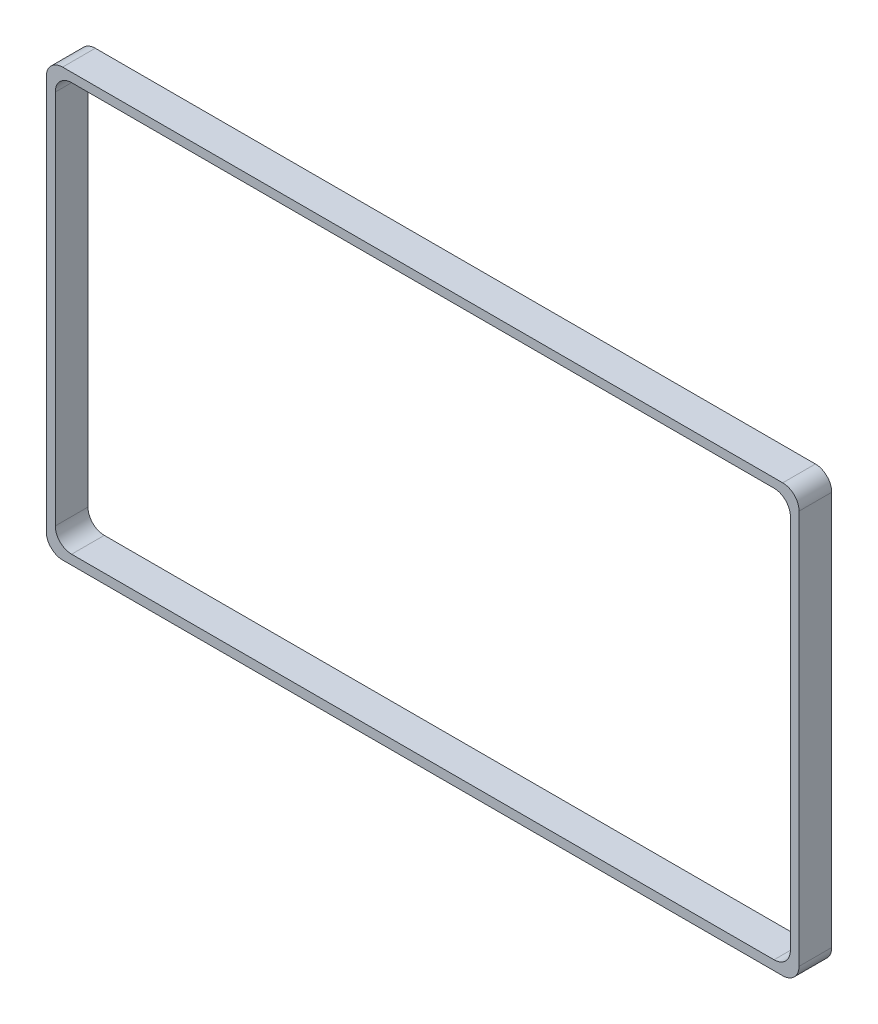
ISO-10303-21;
HEADER;
FILE_DESCRIPTION(('STEP AP214'),'2;1');
FILE_NAME('part.step','',(''),(''),'','','');
FILE_SCHEMA(('AUTOMOTIVE_DESIGN { 1 0 10303 214 1 1 1 1 }'));
ENDSEC;
DATA;
#1=APPLICATION_CONTEXT('core data for automotive mechanical design processes');
#2=APPLICATION_PROTOCOL_DEFINITION('international standard','automotive_design',2000,#1);
#3=PRODUCT_CONTEXT('',#1,'mechanical');
#4=PRODUCT('Part','Part','',(#3));
#5=PRODUCT_RELATED_PRODUCT_CATEGORY('part','',(#4));
#6=PRODUCT_DEFINITION_FORMATION('','',#4);
#7=PRODUCT_DEFINITION_CONTEXT('part definition',#1,'design');
#8=PRODUCT_DEFINITION('design','',#6,#7);
#9=PRODUCT_DEFINITION_SHAPE('','',#8);
#10=(LENGTH_UNIT() NAMED_UNIT(*) SI_UNIT(.MILLI.,.METRE.));
#11=(NAMED_UNIT(*) PLANE_ANGLE_UNIT() SI_UNIT($,.RADIAN.));
#12=(NAMED_UNIT(*) SI_UNIT($,.STERADIAN.) SOLID_ANGLE_UNIT());
#13=UNCERTAINTY_MEASURE_WITH_UNIT(LENGTH_MEASURE(1.E-05),#10,'distance_accuracy_value','');
#14=(GEOMETRIC_REPRESENTATION_CONTEXT(3) GLOBAL_UNCERTAINTY_ASSIGNED_CONTEXT((#13)) GLOBAL_UNIT_ASSIGNED_CONTEXT((#10,
#11,#12)) REPRESENTATION_CONTEXT('',''));
#15=CARTESIAN_POINT('',(0.,0.,0.));
#16=DIRECTION('',(0.,0.,1.));
#17=DIRECTION('',(1.,0.,0.));
#18=AXIS2_PLACEMENT_3D('',#15,#16,#17);
#19=CARTESIAN_POINT('',(-3.36666666666667,0.,0.2));
#20=DIRECTION('',(1.,0.,0.));
#21=DIRECTION('',(0.,1.,0.));
#22=AXIS2_PLACEMENT_3D('',#19,#20,#21);
#23=PLANE('',#22);
#24=DIRECTION('',(0.,-1.,0.));
#25=VECTOR('',#24,1.);
#26=CARTESIAN_POINT('',(-3.36666666666667,0.,0.2));
#27=LINE('',#26,#25);
#28=CARTESIAN_POINT('',(-3.36666666666667,2.45833333333333,0.2));
#29=VERTEX_POINT('',#28);
#30=CARTESIAN_POINT('',(-3.36666666666667,0.158333333333334,0.2));
#31=VERTEX_POINT('',#30);
#32=EDGE_CURVE('E250',#29,#31,#27,.T.);
#33=ORIENTED_EDGE('',*,*,#32,.T.);
#34=DIRECTION('',(0.,0.,-1.));
#35=VECTOR('',#34,1.);
#36=CARTESIAN_POINT('',(-3.36666666666667,0.158333333333334,0.));
#37=LINE('',#36,#35);
#38=CARTESIAN_POINT('',(-3.36666666666667,0.158333333333334,0.));
#39=VERTEX_POINT('',#38);
#40=EDGE_CURVE('E225',#31,#39,#37,.T.);
#41=ORIENTED_EDGE('',*,*,#40,.T.);
#42=DIRECTION('',(0.,-1.,0.));
#43=VECTOR('',#42,1.);
#44=CARTESIAN_POINT('',(-3.36666666666667,0.,0.));
#45=LINE('',#44,#43);
#46=CARTESIAN_POINT('',(-3.36666666666667,2.45833333333333,0.));
#47=VERTEX_POINT('',#46);
#48=EDGE_CURVE('E155',#47,#39,#45,.T.);
#49=ORIENTED_EDGE('',*,*,#48,.F.);
#50=DIRECTION('',(0.,0.,-1.));
#51=VECTOR('',#50,1.);
#52=CARTESIAN_POINT('',(-3.36666666666667,2.45833333333333,0.2));
#53=LINE('',#52,#51);
#54=EDGE_CURVE('E223',#47,#29,#53,.F.);
#55=ORIENTED_EDGE('',*,*,#54,.T.);
#56=EDGE_LOOP('',(#33,#41,#49,#55));
#57=FACE_BOUND('',#56,.T.);
#58=ADVANCED_FACE('F36',(#57),#23,.T.);
#59=CARTESIAN_POINT('',(0.,2.55833333333333,0.2));
#60=DIRECTION('',(0.,1.,0.));
#61=DIRECTION('',(0.,0.,1.));
#62=AXIS2_PLACEMENT_3D('',#59,#60,#61);
#63=PLANE('',#62);
#64=DIRECTION('',(1.,0.,0.));
#65=VECTOR('',#64,1.);
#66=CARTESIAN_POINT('',(0.,2.55833333333333,0.));
#67=LINE('',#66,#65);
#68=CARTESIAN_POINT('',(-3.26666666666667,2.55833333333333,0.));
#69=VERTEX_POINT('',#68);
#70=CARTESIAN_POINT('',(1.03333333333333,2.55833333333333,0.));
#71=VERTEX_POINT('',#70);
#72=EDGE_CURVE('E239',#69,#71,#67,.T.);
#73=ORIENTED_EDGE('',*,*,#72,.T.);
#74=DIRECTION('',(0.,0.,-1.));
#75=VECTOR('',#74,1.);
#76=CARTESIAN_POINT('',(1.03333333333333,2.55833333333333,0.2));
#77=LINE('',#76,#75);
#78=CARTESIAN_POINT('',(1.03333333333333,2.55833333333333,0.2));
#79=VERTEX_POINT('',#78);
#80=EDGE_CURVE('E51',#71,#79,#77,.F.);
#81=ORIENTED_EDGE('',*,*,#80,.T.);
#82=DIRECTION('',(1.,0.,0.));
#83=VECTOR('',#82,1.);
#84=CARTESIAN_POINT('',(0.,2.55833333333333,0.2));
#85=LINE('',#84,#83);
#86=CARTESIAN_POINT('',(-3.26666666666667,2.55833333333333,0.2));
#87=VERTEX_POINT('',#86);
#88=EDGE_CURVE('E248',#87,#79,#85,.T.);
#89=ORIENTED_EDGE('',*,*,#88,.F.);
#90=DIRECTION('',(0.,0.,-1.));
#91=VECTOR('',#90,1.);
#92=CARTESIAN_POINT('',(-3.26666666666667,2.55833333333333,0.2));
#93=LINE('',#92,#91);
#94=EDGE_CURVE('E219',#87,#69,#93,.T.);
#95=ORIENTED_EDGE('',*,*,#94,.T.);
#96=EDGE_LOOP('',(#73,#81,#89,#95));
#97=FACE_BOUND('',#96,.T.);
#98=ADVANCED_FACE('F247',(#97),#63,.F.);
#99=CARTESIAN_POINT('',(1.13333333333333,0.,0.2));
#100=DIRECTION('',(1.,0.,0.));
#101=DIRECTION('',(0.,1.,0.));
#102=AXIS2_PLACEMENT_3D('',#99,#100,#101);
#103=PLANE('',#102);
#104=DIRECTION('',(0.,-1.,0.));
#105=VECTOR('',#104,1.);
#106=CARTESIAN_POINT('',(1.13333333333333,0.,0.));
#107=LINE('',#106,#105);
#108=CARTESIAN_POINT('',(1.13333333333333,2.45833333333333,0.));
#109=VERTEX_POINT('',#108);
#110=CARTESIAN_POINT('',(1.13333333333333,0.158333333333334,0.));
#111=VERTEX_POINT('',#110);
#112=EDGE_CURVE('E172',#109,#111,#107,.T.);
#113=ORIENTED_EDGE('',*,*,#112,.T.);
#114=DIRECTION('',(0.,0.,-1.));
#115=VECTOR('',#114,1.);
#116=CARTESIAN_POINT('',(1.13333333333333,0.158333333333334,0.2));
#117=LINE('',#116,#115);
#118=CARTESIAN_POINT('',(1.13333333333333,0.158333333333334,0.2));
#119=VERTEX_POINT('',#118);
#120=EDGE_CURVE('E186',#111,#119,#117,.F.);
#121=ORIENTED_EDGE('',*,*,#120,.T.);
#122=DIRECTION('',(0.,-1.,0.));
#123=VECTOR('',#122,1.);
#124=CARTESIAN_POINT('',(1.13333333333333,0.,0.2));
#125=LINE('',#124,#123);
#126=CARTESIAN_POINT('',(1.13333333333333,2.45833333333333,0.2));
#127=VERTEX_POINT('',#126);
#128=EDGE_CURVE('E180',#127,#119,#125,.T.);
#129=ORIENTED_EDGE('',*,*,#128,.F.);
#130=DIRECTION('',(0.,0.,-1.));
#131=VECTOR('',#130,1.);
#132=CARTESIAN_POINT('',(1.13333333333333,2.45833333333333,0.));
#133=LINE('',#132,#131);
#134=EDGE_CURVE('E178',#127,#109,#133,.T.);
#135=ORIENTED_EDGE('',*,*,#134,.T.);
#136=EDGE_LOOP('',(#113,#121,#129,#135));
#137=FACE_BOUND('',#136,.T.);
#138=ADVANCED_FACE('F273',(#137),#103,.F.);
#139=CARTESIAN_POINT('',(0.,2.61331643610564,0.2));
#140=DIRECTION('',(0.,1.,0.));
#141=DIRECTION('',(0.,0.,1.));
#142=AXIS2_PLACEMENT_3D('',#139,#140,#141);
#143=PLANE('',#142);
#144=DIRECTION('',(1.,0.,0.));
#145=VECTOR('',#144,1.);
#146=CARTESIAN_POINT('',(0.,2.61331643610564,0.2));
#147=LINE('',#146,#145);
#148=CARTESIAN_POINT('',(-3.32164976943898,2.61331643610564,0.2));
#149=VERTEX_POINT('',#148);
#150=CARTESIAN_POINT('',(1.08635851410446,2.61331643610564,0.2));
#151=VERTEX_POINT('',#150);
#152=EDGE_CURVE('E171',#149,#151,#147,.T.);
#153=ORIENTED_EDGE('',*,*,#152,.T.);
#154=DIRECTION('',(0.,0.,-1.));
#155=VECTOR('',#154,1.);
#156=CARTESIAN_POINT('',(1.08635851410446,2.61331643610564,0.2));
#157=LINE('',#156,#155);
#158=CARTESIAN_POINT('',(1.08635851410446,2.61331643610564,0.));
#159=VERTEX_POINT('',#158);
#160=EDGE_CURVE('E216',#151,#159,#157,.T.);
#161=ORIENTED_EDGE('',*,*,#160,.T.);
#162=DIRECTION('',(1.,0.,0.));
#163=VECTOR('',#162,1.);
#164=CARTESIAN_POINT('',(0.,2.61331643610564,0.));
#165=LINE('',#164,#163);
#166=CARTESIAN_POINT('',(-3.32164976943898,2.61331643610564,0.));
#167=VERTEX_POINT('',#166);
#168=EDGE_CURVE('E258',#167,#159,#165,.T.);
#169=ORIENTED_EDGE('',*,*,#168,.F.);
#170=DIRECTION('',(0.,0.,-1.));
#171=VECTOR('',#170,1.);
#172=CARTESIAN_POINT('',(-3.32164976943898,2.61331643610564,0.2));
#173=LINE('',#172,#171);
#174=EDGE_CURVE('E214',#167,#149,#173,.F.);
#175=ORIENTED_EDGE('',*,*,#174,.T.);
#176=EDGE_LOOP('',(#153,#161,#169,#175));
#177=FACE_BOUND('',#176,.T.);
#178=ADVANCED_FACE('F313',(#177),#143,.T.);
#179=CARTESIAN_POINT('',(-3.42164976943898,0.,0.2));
#180=DIRECTION('',(1.,0.,0.));
#181=DIRECTION('',(0.,0.,-1.));
#182=AXIS2_PLACEMENT_3D('',#179,#180,#181);
#183=PLANE('',#182);
#184=DIRECTION('',(0.,-1.,0.));
#185=VECTOR('',#184,1.);
#186=CARTESIAN_POINT('',(-3.42164976943898,0.,0.));
#187=LINE('',#186,#185);
#188=CARTESIAN_POINT('',(-3.42164976943898,2.51331643610565,0.));
#189=VERTEX_POINT('',#188);
#190=CARTESIAN_POINT('',(-3.42164976943898,0.1,0.));
#191=VERTEX_POINT('',#190);
#192=EDGE_CURVE('E261',#189,#191,#187,.T.);
#193=ORIENTED_EDGE('',*,*,#192,.T.);
#194=DIRECTION('',(0.,0.,-1.));
#195=VECTOR('',#194,1.);
#196=CARTESIAN_POINT('',(-3.42164976943898,0.1,0.2));
#197=LINE('',#196,#195);
#198=CARTESIAN_POINT('',(-3.42164976943898,0.1,0.2));
#199=VERTEX_POINT('',#198);
#200=EDGE_CURVE('E230',#191,#199,#197,.F.);
#201=ORIENTED_EDGE('',*,*,#200,.T.);
#202=DIRECTION('',(0.,-1.,0.));
#203=VECTOR('',#202,1.);
#204=CARTESIAN_POINT('',(-3.42164976943898,0.,0.2));
#205=LINE('',#204,#203);
#206=CARTESIAN_POINT('',(-3.42164976943898,2.51331643610565,0.2));
#207=VERTEX_POINT('',#206);
#208=EDGE_CURVE('E336',#207,#199,#205,.T.);
#209=ORIENTED_EDGE('',*,*,#208,.F.);
#210=DIRECTION('',(0.,0.,-1.));
#211=VECTOR('',#210,1.);
#212=CARTESIAN_POINT('',(-3.42164976943898,2.51331643610565,0.));
#213=LINE('',#212,#211);
#214=EDGE_CURVE('E227',#207,#189,#213,.T.);
#215=ORIENTED_EDGE('',*,*,#214,.T.);
#216=EDGE_LOOP('',(#193,#201,#209,#215));
#217=FACE_BOUND('',#216,.T.);
#218=ADVANCED_FACE('F309',(#217),#183,.F.);
#219=CARTESIAN_POINT('',(0.,0.,0.2));
#220=DIRECTION('',(0.,1.,0.));
#221=DIRECTION('',(0.,0.,1.));
#222=AXIS2_PLACEMENT_3D('',#219,#220,#221);
#223=PLANE('',#222);
#224=DIRECTION('',(1.,0.,0.));
#225=VECTOR('',#224,1.);
#226=CARTESIAN_POINT('',(0.,0.,0.));
#227=LINE('',#226,#225);
#228=CARTESIAN_POINT('',(-3.32164976943898,0.,0.));
#229=VERTEX_POINT('',#228);
#230=CARTESIAN_POINT('',(1.08635851410446,0.,0.));
#231=VERTEX_POINT('',#230);
#232=EDGE_CURVE('E264',#229,#231,#227,.T.);
#233=ORIENTED_EDGE('',*,*,#232,.T.);
#234=DIRECTION('',(0.,0.,-1.));
#235=VECTOR('',#234,1.);
#236=CARTESIAN_POINT('',(1.08635851410446,0.,0.2));
#237=LINE('',#236,#235);
#238=CARTESIAN_POINT('',(1.08635851410446,0.,0.2));
#239=VERTEX_POINT('',#238);
#240=EDGE_CURVE('E204',#231,#239,#237,.F.);
#241=ORIENTED_EDGE('',*,*,#240,.T.);
#242=DIRECTION('',(1.,0.,0.));
#243=VECTOR('',#242,1.);
#244=CARTESIAN_POINT('',(0.,0.,0.2));
#245=LINE('',#244,#243);
#246=CARTESIAN_POINT('',(-3.32164976943898,0.,0.2));
#247=VERTEX_POINT('',#246);
#248=EDGE_CURVE('E333',#247,#239,#245,.T.);
#249=ORIENTED_EDGE('',*,*,#248,.F.);
#250=DIRECTION('',(0.,0.,-1.));
#251=VECTOR('',#250,1.);
#252=CARTESIAN_POINT('',(-3.32164976943898,0.,0.2));
#253=LINE('',#252,#251);
#254=EDGE_CURVE('E201',#247,#229,#253,.T.);
#255=ORIENTED_EDGE('',*,*,#254,.T.);
#256=EDGE_LOOP('',(#233,#241,#249,#255));
#257=FACE_BOUND('',#256,.T.);
#258=ADVANCED_FACE('F305',(#257),#223,.F.);
#259=CARTESIAN_POINT('',(1.18635851410446,0.,0.2));
#260=DIRECTION('',(1.,0.,0.));
#261=DIRECTION('',(0.,0.,-1.));
#262=AXIS2_PLACEMENT_3D('',#259,#260,#261);
#263=PLANE('',#262);
#264=DIRECTION('',(0.,-1.,0.));
#265=VECTOR('',#264,1.);
#266=CARTESIAN_POINT('',(1.18635851410446,0.,0.2));
#267=LINE('',#266,#265);
#268=CARTESIAN_POINT('',(1.18635851410446,2.51331643610565,0.2));
#269=VERTEX_POINT('',#268);
#270=CARTESIAN_POINT('',(1.18635851410446,0.1,0.2));
#271=VERTEX_POINT('',#270);
#272=EDGE_CURVE('E254',#269,#271,#267,.T.);
#273=ORIENTED_EDGE('',*,*,#272,.T.);
#274=DIRECTION('',(0.,0.,-1.));
#275=VECTOR('',#274,1.);
#276=CARTESIAN_POINT('',(1.18635851410446,0.1,0.));
#277=LINE('',#276,#275);
#278=CARTESIAN_POINT('',(1.18635851410446,0.1,0.));
#279=VERTEX_POINT('',#278);
#280=EDGE_CURVE('E190',#271,#279,#277,.T.);
#281=ORIENTED_EDGE('',*,*,#280,.T.);
#282=DIRECTION('',(0.,-1.,0.));
#283=VECTOR('',#282,1.);
#284=CARTESIAN_POINT('',(1.18635851410446,0.,0.));
#285=LINE('',#284,#283);
#286=CARTESIAN_POINT('',(1.18635851410446,2.51331643610565,0.));
#287=VERTEX_POINT('',#286);
#288=EDGE_CURVE('E245',#287,#279,#285,.T.);
#289=ORIENTED_EDGE('',*,*,#288,.F.);
#290=DIRECTION('',(0.,0.,-1.));
#291=VECTOR('',#290,1.);
#292=CARTESIAN_POINT('',(1.18635851410446,2.51331643610565,0.2));
#293=LINE('',#292,#291);
#294=EDGE_CURVE('E188',#287,#269,#293,.F.);
#295=ORIENTED_EDGE('',*,*,#294,.T.);
#296=EDGE_LOOP('',(#273,#281,#289,#295));
#297=FACE_BOUND('',#296,.T.);
#298=ADVANCED_FACE('F302',(#297),#263,.T.);
#299=CARTESIAN_POINT('',(0.,0.0583333333333343,0.2));
#300=DIRECTION('',(0.,1.,0.));
#301=DIRECTION('',(0.,0.,1.));
#302=AXIS2_PLACEMENT_3D('',#299,#300,#301);
#303=PLANE('',#302);
#304=DIRECTION('',(1.,0.,0.));
#305=VECTOR('',#304,1.);
#306=CARTESIAN_POINT('',(0.,0.0583333333333343,0.2));
#307=LINE('',#306,#305);
#308=CARTESIAN_POINT('',(-3.26666666666667,0.0583333333333343,0.2));
#309=VERTEX_POINT('',#308);
#310=CARTESIAN_POINT('',(1.03333333333333,0.0583333333333343,0.2));
#311=VERTEX_POINT('',#310);
#312=EDGE_CURVE('E176',#309,#311,#307,.T.);
#313=ORIENTED_EDGE('',*,*,#312,.T.);
#314=DIRECTION('',(0.,0.,-1.));
#315=VECTOR('',#314,1.);
#316=CARTESIAN_POINT('',(1.03333333333333,0.0583333333333343,0.2));
#317=LINE('',#316,#315);
#318=CARTESIAN_POINT('',(1.03333333333333,0.0583333333333343,0.));
#319=VERTEX_POINT('',#318);
#320=EDGE_CURVE('E170',#311,#319,#317,.T.);
#321=ORIENTED_EDGE('',*,*,#320,.T.);
#322=DIRECTION('',(1.,0.,0.));
#323=VECTOR('',#322,1.);
#324=CARTESIAN_POINT('',(0.,0.0583333333333343,0.));
#325=LINE('',#324,#323);
#326=CARTESIAN_POINT('',(-3.26666666666667,0.0583333333333343,0.));
#327=VERTEX_POINT('',#326);
#328=EDGE_CURVE('E153',#327,#319,#325,.T.);
#329=ORIENTED_EDGE('',*,*,#328,.F.);
#330=DIRECTION('',(0.,0.,-1.));
#331=VECTOR('',#330,1.);
#332=CARTESIAN_POINT('',(-3.26666666666667,0.0583333333333343,0.2));
#333=LINE('',#332,#331);
#334=EDGE_CURVE('E167',#327,#309,#333,.F.);
#335=ORIENTED_EDGE('',*,*,#334,.T.);
#336=EDGE_LOOP('',(#313,#321,#329,#335));
#337=FACE_BOUND('',#336,.T.);
#338=ADVANCED_FACE('F166',(#337),#303,.T.);
#339=CARTESIAN_POINT('',(0.,0.,0.2));
#340=DIRECTION('',(0.,0.,1.));
#341=DIRECTION('',(1.,0.,0.));
#342=AXIS2_PLACEMENT_3D('',#339,#340,#341);
#343=PLANE('',#342);
#344=ORIENTED_EDGE('',*,*,#248,.T.);
#345=CARTESIAN_POINT('',(1.08635851410446,0.1,0.2));
#346=DIRECTION('',(0.,0.,1.));
#347=DIRECTION('',(1.,0.,0.));
#348=AXIS2_PLACEMENT_3D('',#345,#346,#347);
#349=CIRCLE('',#348,0.1);
#350=EDGE_CURVE('E212',#239,#271,#349,.T.);
#351=ORIENTED_EDGE('',*,*,#350,.T.);
#352=ORIENTED_EDGE('',*,*,#272,.F.);
#353=CARTESIAN_POINT('',(1.08635851410446,2.51331643610565,0.2));
#354=DIRECTION('',(0.,0.,1.));
#355=DIRECTION('',(1.,0.,0.));
#356=AXIS2_PLACEMENT_3D('',#353,#354,#355);
#357=CIRCLE('',#356,0.1);
#358=EDGE_CURVE('E210',#269,#151,#357,.T.);
#359=ORIENTED_EDGE('',*,*,#358,.T.);
#360=ORIENTED_EDGE('',*,*,#152,.F.);
#361=CARTESIAN_POINT('',(-3.32164976943898,2.51331643610565,0.2));
#362=DIRECTION('',(0.,0.,1.));
#363=DIRECTION('',(1.,0.,0.));
#364=AXIS2_PLACEMENT_3D('',#361,#362,#363);
#365=CIRCLE('',#364,0.1);
#366=EDGE_CURVE('E206',#149,#207,#365,.T.);
#367=ORIENTED_EDGE('',*,*,#366,.T.);
#368=ORIENTED_EDGE('',*,*,#208,.T.);
#369=CARTESIAN_POINT('',(-3.32164976943898,0.1,0.2));
#370=DIRECTION('',(0.,0.,1.));
#371=DIRECTION('',(1.,0.,0.));
#372=AXIS2_PLACEMENT_3D('',#369,#370,#371);
#373=CIRCLE('',#372,0.1);
#374=EDGE_CURVE('E208',#199,#247,#373,.T.);
#375=ORIENTED_EDGE('',*,*,#374,.T.);
#376=EDGE_LOOP('',(#344,#351,#352,#359,#360,#367,#368,#375));
#377=FACE_BOUND('',#376,.T.);
#378=ORIENTED_EDGE('',*,*,#32,.F.);
#379=CARTESIAN_POINT('',(-3.26666666666667,2.45833333333333,0.2));
#380=DIRECTION('',(0.,0.,1.));
#381=DIRECTION('',(1.,0.,0.));
#382=AXIS2_PLACEMENT_3D('',#379,#380,#381);
#383=CIRCLE('',#382,0.1);
#384=EDGE_CURVE('E11',#29,#87,#383,.F.);
#385=ORIENTED_EDGE('',*,*,#384,.T.);
#386=ORIENTED_EDGE('',*,*,#88,.T.);
#387=CARTESIAN_POINT('',(1.03333333333333,2.45833333333333,0.2));
#388=DIRECTION('',(0.,0.,1.));
#389=DIRECTION('',(1.,0.,0.));
#390=AXIS2_PLACEMENT_3D('',#387,#388,#389);
#391=CIRCLE('',#390,0.1);
#392=EDGE_CURVE('E161',#79,#127,#391,.F.);
#393=ORIENTED_EDGE('',*,*,#392,.T.);
#394=ORIENTED_EDGE('',*,*,#128,.T.);
#395=CARTESIAN_POINT('',(1.03333333333333,0.158333333333334,0.2));
#396=DIRECTION('',(0.,0.,1.));
#397=DIRECTION('',(1.,0.,0.));
#398=AXIS2_PLACEMENT_3D('',#395,#396,#397);
#399=CIRCLE('',#398,0.1);
#400=EDGE_CURVE('E234',#119,#311,#399,.F.);
#401=ORIENTED_EDGE('',*,*,#400,.T.);
#402=ORIENTED_EDGE('',*,*,#312,.F.);
#403=CARTESIAN_POINT('',(-3.26666666666667,0.158333333333334,0.2));
#404=DIRECTION('',(0.,0.,1.));
#405=DIRECTION('',(1.,0.,0.));
#406=AXIS2_PLACEMENT_3D('',#403,#404,#405);
#407=CIRCLE('',#406,0.1);
#408=EDGE_CURVE('E160',#309,#31,#407,.F.);
#409=ORIENTED_EDGE('',*,*,#408,.T.);
#410=EDGE_LOOP('',(#378,#385,#386,#393,#394,#401,#402,#409));
#411=FACE_BOUND('',#410,.T.);
#412=ADVANCED_FACE('F279',(#377,#411),#343,.T.);
#413=CARTESIAN_POINT('',(0.,0.,0.));
#414=DIRECTION('',(0.,0.,1.));
#415=DIRECTION('',(1.,0.,0.));
#416=AXIS2_PLACEMENT_3D('',#413,#414,#415);
#417=PLANE('',#416);
#418=ORIENTED_EDGE('',*,*,#288,.T.);
#419=CARTESIAN_POINT('',(1.08635851410446,0.1,0.));
#420=DIRECTION('',(0.,0.,1.));
#421=DIRECTION('',(1.,0.,0.));
#422=AXIS2_PLACEMENT_3D('',#419,#420,#421);
#423=CIRCLE('',#422,0.1);
#424=EDGE_CURVE('E199',#279,#231,#423,.F.);
#425=ORIENTED_EDGE('',*,*,#424,.T.);
#426=ORIENTED_EDGE('',*,*,#232,.F.);
#427=CARTESIAN_POINT('',(-3.32164976943898,0.1,0.));
#428=DIRECTION('',(0.,0.,1.));
#429=DIRECTION('',(1.,0.,0.));
#430=AXIS2_PLACEMENT_3D('',#427,#428,#429);
#431=CIRCLE('',#430,0.1);
#432=EDGE_CURVE('E195',#229,#191,#431,.F.);
#433=ORIENTED_EDGE('',*,*,#432,.T.);
#434=ORIENTED_EDGE('',*,*,#192,.F.);
#435=CARTESIAN_POINT('',(-3.32164976943898,2.51331643610565,0.));
#436=DIRECTION('',(0.,0.,1.));
#437=DIRECTION('',(1.,0.,0.));
#438=AXIS2_PLACEMENT_3D('',#435,#436,#437);
#439=CIRCLE('',#438,0.1);
#440=EDGE_CURVE('E193',#189,#167,#439,.F.);
#441=ORIENTED_EDGE('',*,*,#440,.T.);
#442=ORIENTED_EDGE('',*,*,#168,.T.);
#443=CARTESIAN_POINT('',(1.08635851410446,2.51331643610565,0.));
#444=DIRECTION('',(0.,0.,1.));
#445=DIRECTION('',(1.,0.,0.));
#446=AXIS2_PLACEMENT_3D('',#443,#444,#445);
#447=CIRCLE('',#446,0.1);
#448=EDGE_CURVE('E197',#159,#287,#447,.F.);
#449=ORIENTED_EDGE('',*,*,#448,.T.);
#450=EDGE_LOOP('',(#418,#425,#426,#433,#434,#441,#442,#449));
#451=FACE_BOUND('',#450,.T.);
#452=ORIENTED_EDGE('',*,*,#72,.F.);
#453=CARTESIAN_POINT('',(-3.26666666666667,2.45833333333333,0.));
#454=DIRECTION('',(0.,0.,1.));
#455=DIRECTION('',(1.,0.,0.));
#456=AXIS2_PLACEMENT_3D('',#453,#454,#455);
#457=CIRCLE('',#456,0.1);
#458=EDGE_CURVE('E44',#69,#47,#457,.T.);
#459=ORIENTED_EDGE('',*,*,#458,.T.);
#460=ORIENTED_EDGE('',*,*,#48,.T.);
#461=CARTESIAN_POINT('',(-3.26666666666667,0.158333333333334,0.));
#462=DIRECTION('',(0.,0.,1.));
#463=DIRECTION('',(1.,0.,0.));
#464=AXIS2_PLACEMENT_3D('',#461,#462,#463);
#465=CIRCLE('',#464,0.1);
#466=EDGE_CURVE('E149',#39,#327,#465,.T.);
#467=ORIENTED_EDGE('',*,*,#466,.T.);
#468=ORIENTED_EDGE('',*,*,#328,.T.);
#469=CARTESIAN_POINT('',(1.03333333333333,0.158333333333334,0.));
#470=DIRECTION('',(0.,0.,1.));
#471=DIRECTION('',(1.,0.,0.));
#472=AXIS2_PLACEMENT_3D('',#469,#470,#471);
#473=CIRCLE('',#472,0.1);
#474=EDGE_CURVE('E232',#319,#111,#473,.T.);
#475=ORIENTED_EDGE('',*,*,#474,.T.);
#476=ORIENTED_EDGE('',*,*,#112,.F.);
#477=CARTESIAN_POINT('',(1.03333333333333,2.45833333333333,0.));
#478=DIRECTION('',(0.,0.,1.));
#479=DIRECTION('',(1.,0.,0.));
#480=AXIS2_PLACEMENT_3D('',#477,#478,#479);
#481=CIRCLE('',#480,0.1);
#482=EDGE_CURVE('E236',#109,#71,#481,.T.);
#483=ORIENTED_EDGE('',*,*,#482,.T.);
#484=EDGE_LOOP('',(#452,#459,#460,#467,#468,#475,#476,#483));
#485=FACE_BOUND('',#484,.T.);
#486=ADVANCED_FACE('F152',(#451,#485),#417,.F.);
#487=CARTESIAN_POINT('',(1.03333333333333,0.158333333333334,0.2));
#488=DIRECTION('',(0.,0.,-1.));
#489=DIRECTION('',(-1.,0.,0.));
#490=AXIS2_PLACEMENT_3D('',#487,#488,#489);
#491=CYLINDRICAL_SURFACE('',#490,0.1);
#492=ORIENTED_EDGE('',*,*,#400,.F.);
#493=ORIENTED_EDGE('',*,*,#120,.F.);
#494=ORIENTED_EDGE('',*,*,#474,.F.);
#495=ORIENTED_EDGE('',*,*,#320,.F.);
#496=EDGE_LOOP('',(#492,#493,#494,#495));
#497=FACE_BOUND('',#496,.T.);
#498=ADVANCED_FACE('F278',(#497),#491,.F.);
#499=CARTESIAN_POINT('',(1.08635851410446,0.1,0.2));
#500=DIRECTION('',(0.,0.,1.));
#501=DIRECTION('',(1.,0.,0.));
#502=AXIS2_PLACEMENT_3D('',#499,#500,#501);
#503=CYLINDRICAL_SURFACE('',#502,0.1);
#504=ORIENTED_EDGE('',*,*,#350,.F.);
#505=ORIENTED_EDGE('',*,*,#240,.F.);
#506=ORIENTED_EDGE('',*,*,#424,.F.);
#507=ORIENTED_EDGE('',*,*,#280,.F.);
#508=EDGE_LOOP('',(#504,#505,#506,#507));
#509=FACE_BOUND('',#508,.T.);
#510=ADVANCED_FACE('F291',(#509),#503,.T.);
#511=CARTESIAN_POINT('',(1.08635851410446,2.51331643610565,0.2));
#512=DIRECTION('',(0.,0.,-1.));
#513=DIRECTION('',(-1.,0.,0.));
#514=AXIS2_PLACEMENT_3D('',#511,#512,#513);
#515=CYLINDRICAL_SURFACE('',#514,0.1);
#516=ORIENTED_EDGE('',*,*,#358,.F.);
#517=ORIENTED_EDGE('',*,*,#294,.F.);
#518=ORIENTED_EDGE('',*,*,#448,.F.);
#519=ORIENTED_EDGE('',*,*,#160,.F.);
#520=EDGE_LOOP('',(#516,#517,#518,#519));
#521=FACE_BOUND('',#520,.T.);
#522=ADVANCED_FACE('F283',(#521),#515,.T.);
#523=CARTESIAN_POINT('',(1.03333333333333,2.45833333333333,0.2));
#524=DIRECTION('',(0.,0.,1.));
#525=DIRECTION('',(1.,0.,0.));
#526=AXIS2_PLACEMENT_3D('',#523,#524,#525);
#527=CYLINDRICAL_SURFACE('',#526,0.1);
#528=ORIENTED_EDGE('',*,*,#392,.F.);
#529=ORIENTED_EDGE('',*,*,#80,.F.);
#530=ORIENTED_EDGE('',*,*,#482,.F.);
#531=ORIENTED_EDGE('',*,*,#134,.F.);
#532=EDGE_LOOP('',(#528,#529,#530,#531));
#533=FACE_BOUND('',#532,.T.);
#534=ADVANCED_FACE('F281',(#533),#527,.F.);
#535=CARTESIAN_POINT('',(-3.26666666666667,0.158333333333334,0.2));
#536=DIRECTION('',(0.,0.,1.));
#537=DIRECTION('',(1.,0.,0.));
#538=AXIS2_PLACEMENT_3D('',#535,#536,#537);
#539=CYLINDRICAL_SURFACE('',#538,0.1);
#540=ORIENTED_EDGE('',*,*,#408,.F.);
#541=ORIENTED_EDGE('',*,*,#334,.F.);
#542=ORIENTED_EDGE('',*,*,#466,.F.);
#543=ORIENTED_EDGE('',*,*,#40,.F.);
#544=EDGE_LOOP('',(#540,#541,#542,#543));
#545=FACE_BOUND('',#544,.T.);
#546=ADVANCED_FACE('F175',(#545),#539,.F.);
#547=CARTESIAN_POINT('',(-3.32164976943898,0.1,0.2));
#548=DIRECTION('',(0.,0.,-1.));
#549=DIRECTION('',(-1.,0.,0.));
#550=AXIS2_PLACEMENT_3D('',#547,#548,#549);
#551=CYLINDRICAL_SURFACE('',#550,0.1);
#552=ORIENTED_EDGE('',*,*,#374,.F.);
#553=ORIENTED_EDGE('',*,*,#200,.F.);
#554=ORIENTED_EDGE('',*,*,#432,.F.);
#555=ORIENTED_EDGE('',*,*,#254,.F.);
#556=EDGE_LOOP('',(#552,#553,#554,#555));
#557=FACE_BOUND('',#556,.T.);
#558=ADVANCED_FACE('F289',(#557),#551,.T.);
#559=CARTESIAN_POINT('',(-3.32164976943898,2.51331643610565,0.2));
#560=DIRECTION('',(0.,0.,1.));
#561=DIRECTION('',(1.,0.,0.));
#562=AXIS2_PLACEMENT_3D('',#559,#560,#561);
#563=CYLINDRICAL_SURFACE('',#562,0.1);
#564=ORIENTED_EDGE('',*,*,#366,.F.);
#565=ORIENTED_EDGE('',*,*,#174,.F.);
#566=ORIENTED_EDGE('',*,*,#440,.F.);
#567=ORIENTED_EDGE('',*,*,#214,.F.);
#568=EDGE_LOOP('',(#564,#565,#566,#567));
#569=FACE_BOUND('',#568,.T.);
#570=ADVANCED_FACE('F350',(#569),#563,.T.);
#571=CARTESIAN_POINT('',(-3.26666666666667,2.45833333333333,0.2));
#572=DIRECTION('',(0.,0.,-1.));
#573=DIRECTION('',(-1.,0.,0.));
#574=AXIS2_PLACEMENT_3D('',#571,#572,#573);
#575=CYLINDRICAL_SURFACE('',#574,0.1);
#576=ORIENTED_EDGE('',*,*,#384,.F.);
#577=ORIENTED_EDGE('',*,*,#54,.F.);
#578=ORIENTED_EDGE('',*,*,#458,.F.);
#579=ORIENTED_EDGE('',*,*,#94,.F.);
#580=EDGE_LOOP('',(#576,#577,#578,#579));
#581=FACE_BOUND('',#580,.T.);
#582=ADVANCED_FACE('F38',(#581),#575,.F.);
#583=CLOSED_SHELL('',(#58,#98,#138,#178,#218,#258,#298,#338,#412,#486,#498,#510,#522,#534,#546,
#558,#570,#582));
#584=MANIFOLD_SOLID_BREP('B2',#583);
#585=ADVANCED_BREP_SHAPE_REPRESENTATION('',(#18,#584),#14);
#586=SHAPE_DEFINITION_REPRESENTATION(#9,#585);
ENDSEC;
END-ISO-10303-21;
